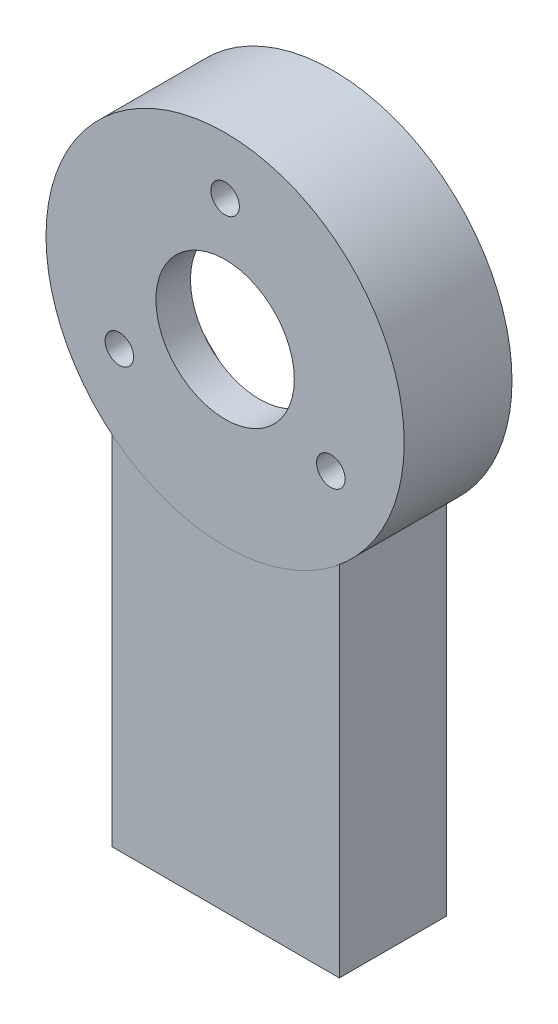
ISO-10303-21;
HEADER;
FILE_DESCRIPTION(('STEP AP214'),'2;1');
FILE_NAME('part.step','',(''),(''),'','','');
FILE_SCHEMA(('AUTOMOTIVE_DESIGN { 1 0 10303 214 1 1 1 1 }'));
ENDSEC;
DATA;
#1=APPLICATION_CONTEXT('core data for automotive mechanical design processes');
#2=APPLICATION_PROTOCOL_DEFINITION('international standard','automotive_design',2000,#1);
#3=PRODUCT_CONTEXT('',#1,'mechanical');
#4=PRODUCT('Part','Part','',(#3));
#5=PRODUCT_RELATED_PRODUCT_CATEGORY('part','',(#4));
#6=PRODUCT_DEFINITION_FORMATION('','',#4);
#7=PRODUCT_DEFINITION_CONTEXT('part definition',#1,'design');
#8=PRODUCT_DEFINITION('design','',#6,#7);
#9=PRODUCT_DEFINITION_SHAPE('','',#8);
#10=(LENGTH_UNIT() NAMED_UNIT(*) SI_UNIT(.MILLI.,.METRE.));
#11=(NAMED_UNIT(*) PLANE_ANGLE_UNIT() SI_UNIT($,.RADIAN.));
#12=(NAMED_UNIT(*) SI_UNIT($,.STERADIAN.) SOLID_ANGLE_UNIT());
#13=UNCERTAINTY_MEASURE_WITH_UNIT(LENGTH_MEASURE(1.E-05),#10,'distance_accuracy_value','');
#14=(GEOMETRIC_REPRESENTATION_CONTEXT(3) GLOBAL_UNCERTAINTY_ASSIGNED_CONTEXT((#13)) GLOBAL_UNIT_ASSIGNED_CONTEXT((#10,
#11,#12)) REPRESENTATION_CONTEXT('',''));
#15=CARTESIAN_POINT('',(0.,0.,0.));
#16=DIRECTION('',(0.,0.,1.));
#17=DIRECTION('',(1.,0.,0.));
#18=AXIS2_PLACEMENT_3D('',#15,#16,#17);
#19=CARTESIAN_POINT('',(0.,15.,-3.24236973091773));
#20=DIRECTION('',(0.,0.,1.));
#21=DIRECTION('',(1.,0.,0.));
#22=AXIS2_PLACEMENT_3D('',#19,#20,#21);
#23=CYLINDRICAL_SURFACE('',#22,1.75);
#24=CARTESIAN_POINT('',(0.,15.,10.));
#25=DIRECTION('',(0.,0.,1.));
#26=DIRECTION('',(1.,0.,0.));
#27=AXIS2_PLACEMENT_3D('',#24,#25,#26);
#28=CIRCLE('',#27,1.75);
#29=CARTESIAN_POINT('',(1.75,15.,10.));
#30=VERTEX_POINT('',#29);
#31=EDGE_CURVE('E118',#30,#30,#28,.T.);
#32=ORIENTED_EDGE('',*,*,#31,.T.);
#33=EDGE_LOOP('',(#32));
#34=FACE_BOUND('',#33,.T.);
#35=CARTESIAN_POINT('',(0.,15.,5.75763026908227));
#36=DIRECTION('',(0.,0.,-1.));
#37=DIRECTION('',(-1.,0.,0.));
#38=AXIS2_PLACEMENT_3D('',#35,#36,#37);
#39=CIRCLE('',#38,1.75);
#40=CARTESIAN_POINT('',(-1.75,15.,5.75763026908227));
#41=VERTEX_POINT('',#40);
#42=EDGE_CURVE('E99',#41,#41,#39,.F.);
#43=ORIENTED_EDGE('',*,*,#42,.F.);
#44=EDGE_LOOP('',(#43));
#45=FACE_BOUND('',#44,.T.);
#46=ADVANCED_FACE('F33',(#34,#45),#23,.F.);
#47=CARTESIAN_POINT('',(0.,0.,-3.24236973091773));
#48=DIRECTION('',(0.,0.,1.));
#49=DIRECTION('',(1.,0.,0.));
#50=AXIS2_PLACEMENT_3D('',#47,#48,#49);
#51=CYLINDRICAL_SURFACE('',#50,8.5);
#52=CARTESIAN_POINT('',(0.,0.,10.));
#53=DIRECTION('',(0.,0.,1.));
#54=DIRECTION('',(1.,0.,0.));
#55=AXIS2_PLACEMENT_3D('',#52,#53,#54);
#56=CIRCLE('',#55,8.5);
#57=CARTESIAN_POINT('',(8.5,0.,10.));
#58=VERTEX_POINT('',#57);
#59=EDGE_CURVE('E115',#58,#58,#56,.T.);
#60=ORIENTED_EDGE('',*,*,#59,.T.);
#61=EDGE_LOOP('',(#60));
#62=FACE_BOUND('',#61,.T.);
#63=CARTESIAN_POINT('',(0.,0.,5.75763026908227));
#64=DIRECTION('',(0.,0.,-1.));
#65=DIRECTION('',(-1.,0.,0.));
#66=AXIS2_PLACEMENT_3D('',#63,#64,#65);
#67=CIRCLE('',#66,8.5);
#68=CARTESIAN_POINT('',(-8.5,0.,5.75763026908227));
#69=VERTEX_POINT('',#68);
#70=EDGE_CURVE('E190',#69,#69,#67,.F.);
#71=ORIENTED_EDGE('',*,*,#70,.F.);
#72=EDGE_LOOP('',(#71));
#73=FACE_BOUND('',#72,.T.);
#74=ADVANCED_FACE('F143',(#62,#73),#51,.F.);
#75=CARTESIAN_POINT('',(12.9903810567672,-7.49999999999963,-3.24236973091773));
#76=DIRECTION('',(0.,0.,1.));
#77=DIRECTION('',(1.,0.,0.));
#78=AXIS2_PLACEMENT_3D('',#75,#76,#77);
#79=CYLINDRICAL_SURFACE('',#78,1.75000000000057);
#80=CARTESIAN_POINT('',(12.9903810567672,-7.49999999999963,10.));
#81=DIRECTION('',(0.,0.,1.));
#82=DIRECTION('',(1.,0.,0.));
#83=AXIS2_PLACEMENT_3D('',#80,#81,#82);
#84=CIRCLE('',#83,1.75000000000057);
#85=CARTESIAN_POINT('',(14.7403810567678,-7.49999999999963,10.));
#86=VERTEX_POINT('',#85);
#87=EDGE_CURVE('E112',#86,#86,#84,.T.);
#88=ORIENTED_EDGE('',*,*,#87,.T.);
#89=EDGE_LOOP('',(#88));
#90=FACE_BOUND('',#89,.T.);
#91=CARTESIAN_POINT('',(12.9903810567672,-7.49999999999963,5.75763026908227));
#92=DIRECTION('',(0.,0.,-1.));
#93=DIRECTION('',(-1.,0.,0.));
#94=AXIS2_PLACEMENT_3D('',#91,#92,#93);
#95=CIRCLE('',#94,1.75000000000057);
#96=CARTESIAN_POINT('',(11.2403810567666,-7.49999999999963,5.75763026908227));
#97=VERTEX_POINT('',#96);
#98=EDGE_CURVE('E186',#97,#97,#95,.F.);
#99=ORIENTED_EDGE('',*,*,#98,.F.);
#100=EDGE_LOOP('',(#99));
#101=FACE_BOUND('',#100,.T.);
#102=ADVANCED_FACE('F148',(#90,#101),#79,.F.);
#103=CARTESIAN_POINT('',(-12.9903810567659,-7.50000000000037,-3.24236973091773));
#104=DIRECTION('',(0.,0.,1.));
#105=DIRECTION('',(1.,0.,0.));
#106=AXIS2_PLACEMENT_3D('',#103,#104,#105);
#107=CYLINDRICAL_SURFACE('',#106,1.75000000000085);
#108=CARTESIAN_POINT('',(-12.9903810567659,-7.50000000000037,10.));
#109=DIRECTION('',(0.,0.,1.));
#110=DIRECTION('',(1.,0.,0.));
#111=AXIS2_PLACEMENT_3D('',#108,#109,#110);
#112=CIRCLE('',#111,1.75000000000085);
#113=CARTESIAN_POINT('',(-11.2403810567651,-7.50000000000037,10.));
#114=VERTEX_POINT('',#113);
#115=EDGE_CURVE('E107',#114,#114,#112,.T.);
#116=ORIENTED_EDGE('',*,*,#115,.T.);
#117=EDGE_LOOP('',(#116));
#118=FACE_BOUND('',#117,.T.);
#119=CARTESIAN_POINT('',(-12.9903810567659,-7.50000000000037,5.75763026908227));
#120=DIRECTION('',(0.,0.,-1.));
#121=DIRECTION('',(-1.,0.,0.));
#122=AXIS2_PLACEMENT_3D('',#119,#120,#121);
#123=CIRCLE('',#122,1.75000000000085);
#124=CARTESIAN_POINT('',(-14.7403810567668,-7.50000000000037,5.75763026908227));
#125=VERTEX_POINT('',#124);
#126=EDGE_CURVE('E37',#125,#125,#123,.F.);
#127=ORIENTED_EDGE('',*,*,#126,.F.);
#128=EDGE_LOOP('',(#127));
#129=FACE_BOUND('',#128,.T.);
#130=ADVANCED_FACE('F139',(#118,#129),#107,.F.);
#131=CARTESIAN_POINT('',(0.,0.,-3.24236973091773));
#132=DIRECTION('',(0.,0.,1.));
#133=DIRECTION('',(1.,0.,0.));
#134=AXIS2_PLACEMENT_3D('',#131,#132,#133);
#135=CYLINDRICAL_SURFACE('',#134,22.);
#136=DIRECTION('',(0.,0.,-1.));
#137=VECTOR('',#136,1.);
#138=CARTESIAN_POINT('',(13.9535665739957,-17.0087618557339,9.91810473822878));
#139=LINE('',#138,#137);
#140=CARTESIAN_POINT('',(13.9535665739957,-17.0087618557339,9.91810473822878));
#141=VERTEX_POINT('',#140);
#142=CARTESIAN_POINT('',(13.9535665739957,-17.0087618557339,-3.24236973091773));
#143=VERTEX_POINT('',#142);
#144=EDGE_CURVE('E93',#141,#143,#139,.T.);
#145=ORIENTED_EDGE('',*,*,#144,.T.);
#146=CARTESIAN_POINT('',(0.,0.,-3.24236973091773));
#147=DIRECTION('',(0.,0.,1.));
#148=DIRECTION('',(1.,0.,0.));
#149=AXIS2_PLACEMENT_3D('',#146,#147,#148);
#150=CIRCLE('',#149,22.);
#151=CARTESIAN_POINT('',(-13.9535665739957,-17.0087618557339,-3.24236973091773));
#152=VERTEX_POINT('',#151);
#153=EDGE_CURVE('E42',#143,#152,#150,.T.);
#154=ORIENTED_EDGE('',*,*,#153,.T.);
#155=DIRECTION('',(0.,0.,-1.));
#156=VECTOR('',#155,1.);
#157=CARTESIAN_POINT('',(-13.9535665739957,-17.0087618557339,9.91810473822878));
#158=LINE('',#157,#156);
#159=CARTESIAN_POINT('',(-13.9535665739957,-17.0087618557339,9.91810473822878));
#160=VERTEX_POINT('',#159);
#161=EDGE_CURVE('E52',#160,#152,#158,.T.);
#162=ORIENTED_EDGE('',*,*,#161,.F.);
#163=CARTESIAN_POINT('',(0.,0.,9.91810473822878));
#164=DIRECTION('',(0.,0.,-1.));
#165=DIRECTION('',(-1.,0.,0.));
#166=AXIS2_PLACEMENT_3D('',#163,#164,#165);
#167=CIRCLE('',#166,22.);
#168=EDGE_CURVE('E11',#160,#141,#167,.F.);
#169=ORIENTED_EDGE('',*,*,#168,.T.);
#170=EDGE_LOOP('',(#145,#154,#162,#169));
#171=FACE_BOUND('',#170,.T.);
#172=CARTESIAN_POINT('',(0.,0.,10.));
#173=DIRECTION('',(0.,0.,1.));
#174=DIRECTION('',(1.,0.,0.));
#175=AXIS2_PLACEMENT_3D('',#172,#173,#174);
#176=CIRCLE('',#175,22.);
#177=CARTESIAN_POINT('',(22.,0.,10.));
#178=VERTEX_POINT('',#177);
#179=EDGE_CURVE('E121',#178,#178,#176,.T.);
#180=ORIENTED_EDGE('',*,*,#179,.F.);
#181=EDGE_LOOP('',(#180));
#182=FACE_BOUND('',#181,.T.);
#183=ADVANCED_FACE('F35',(#171,#182),#135,.T.);
#184=CARTESIAN_POINT('',(0.,0.,-3.24236973091773));
#185=DIRECTION('',(0.,0.,1.));
#186=DIRECTION('',(1.,0.,0.));
#187=AXIS2_PLACEMENT_3D('',#184,#185,#186);
#188=PLANE('',#187);
#189=CARTESIAN_POINT('',(0.,0.,-3.24236973091773));
#190=DIRECTION('',(0.,0.,-1.));
#191=DIRECTION('',(-1.,0.,0.));
#192=AXIS2_PLACEMENT_3D('',#189,#190,#191);
#193=CIRCLE('',#192,21.15);
#194=CARTESIAN_POINT('',(-21.15,0.,-3.24236973091773));
#195=VERTEX_POINT('',#194);
#196=EDGE_CURVE('E195',#195,#195,#193,.T.);
#197=ORIENTED_EDGE('',*,*,#196,.F.);
#198=EDGE_LOOP('',(#197));
#199=FACE_BOUND('',#198,.T.);
#200=ORIENTED_EDGE('',*,*,#153,.F.);
#201=DIRECTION('',(0.,-1.,0.));
#202=VECTOR('',#201,1.);
#203=CARTESIAN_POINT('',(13.9535665739957,-17.0087618557339,-3.24236973091773));
#204=LINE('',#203,#202);
#205=CARTESIAN_POINT('',(13.9535665739957,-61.,-3.24236973091773));
#206=VERTEX_POINT('',#205);
#207=EDGE_CURVE('E103',#143,#206,#204,.T.);
#208=ORIENTED_EDGE('',*,*,#207,.T.);
#209=DIRECTION('',(-1.,0.,0.));
#210=VECTOR('',#209,1.);
#211=CARTESIAN_POINT('',(13.9535665739957,-61.,-3.24236973091773));
#212=LINE('',#211,#210);
#213=CARTESIAN_POINT('',(-13.9535665739957,-61.,-3.24236973091773));
#214=VERTEX_POINT('',#213);
#215=EDGE_CURVE('E77',#206,#214,#212,.T.);
#216=ORIENTED_EDGE('',*,*,#215,.T.);
#217=DIRECTION('',(0.,1.,0.));
#218=VECTOR('',#217,1.);
#219=CARTESIAN_POINT('',(-13.9535665739957,-17.0087618557339,-3.24236973091773));
#220=LINE('',#219,#218);
#221=EDGE_CURVE('E94',#214,#152,#220,.T.);
#222=ORIENTED_EDGE('',*,*,#221,.T.);
#223=EDGE_LOOP('',(#200,#208,#216,#222));
#224=FACE_BOUND('',#223,.T.);
#225=ADVANCED_FACE('F129',(#199,#224),#188,.F.);
#226=CARTESIAN_POINT('',(0.,0.,10.));
#227=DIRECTION('',(0.,0.,1.));
#228=DIRECTION('',(1.,0.,0.));
#229=AXIS2_PLACEMENT_3D('',#226,#227,#228);
#230=PLANE('',#229);
#231=ORIENTED_EDGE('',*,*,#87,.F.);
#232=EDGE_LOOP('',(#231));
#233=FACE_BOUND('',#232,.T.);
#234=ORIENTED_EDGE('',*,*,#31,.F.);
#235=EDGE_LOOP('',(#234));
#236=FACE_BOUND('',#235,.T.);
#237=ORIENTED_EDGE('',*,*,#179,.T.);
#238=EDGE_LOOP('',(#237));
#239=FACE_BOUND('',#238,.T.);
#240=ORIENTED_EDGE('',*,*,#59,.F.);
#241=EDGE_LOOP('',(#240));
#242=FACE_BOUND('',#241,.T.);
#243=ORIENTED_EDGE('',*,*,#115,.F.);
#244=EDGE_LOOP('',(#243));
#245=FACE_BOUND('',#244,.T.);
#246=ADVANCED_FACE('F131',(#233,#236,#239,#242,#245),#230,.T.);
#247=CARTESIAN_POINT('',(13.9535665739957,-17.0087618557339,9.91810473822878));
#248=DIRECTION('',(1.,0.,0.));
#249=DIRECTION('',(0.,1.,0.));
#250=AXIS2_PLACEMENT_3D('',#247,#248,#249);
#251=PLANE('',#250);
#252=ORIENTED_EDGE('',*,*,#207,.F.);
#253=ORIENTED_EDGE('',*,*,#144,.F.);
#254=DIRECTION('',(0.,-1.,0.));
#255=VECTOR('',#254,1.);
#256=CARTESIAN_POINT('',(13.9535665739957,-17.0087618557339,9.91810473822878));
#257=LINE('',#256,#255);
#258=CARTESIAN_POINT('',(13.9535665739957,-61.,9.91810473822878));
#259=VERTEX_POINT('',#258);
#260=EDGE_CURVE('E89',#141,#259,#257,.T.);
#261=ORIENTED_EDGE('',*,*,#260,.T.);
#262=DIRECTION('',(0.,0.,-1.));
#263=VECTOR('',#262,1.);
#264=CARTESIAN_POINT('',(13.9535665739957,-61.,9.91810473822878));
#265=LINE('',#264,#263);
#266=EDGE_CURVE('E72',#259,#206,#265,.T.);
#267=ORIENTED_EDGE('',*,*,#266,.T.);
#268=EDGE_LOOP('',(#252,#253,#261,#267));
#269=FACE_BOUND('',#268,.T.);
#270=ADVANCED_FACE('F92',(#269),#251,.T.);
#271=CARTESIAN_POINT('',(-13.9535665739957,-17.0087618557339,9.91810473822878));
#272=DIRECTION('',(-1.,0.,0.));
#273=DIRECTION('',(0.,-1.,0.));
#274=AXIS2_PLACEMENT_3D('',#271,#272,#273);
#275=PLANE('',#274);
#276=ORIENTED_EDGE('',*,*,#221,.F.);
#277=DIRECTION('',(0.,0.,-1.));
#278=VECTOR('',#277,1.);
#279=CARTESIAN_POINT('',(-13.9535665739957,-61.,9.91810473822878));
#280=LINE('',#279,#278);
#281=CARTESIAN_POINT('',(-13.9535665739957,-61.,9.91810473822878));
#282=VERTEX_POINT('',#281);
#283=EDGE_CURVE('E82',#282,#214,#280,.T.);
#284=ORIENTED_EDGE('',*,*,#283,.F.);
#285=DIRECTION('',(0.,1.,0.));
#286=VECTOR('',#285,1.);
#287=CARTESIAN_POINT('',(-13.9535665739957,-17.0087618557339,9.91810473822878));
#288=LINE('',#287,#286);
#289=EDGE_CURVE('E83',#282,#160,#288,.T.);
#290=ORIENTED_EDGE('',*,*,#289,.T.);
#291=ORIENTED_EDGE('',*,*,#161,.T.);
#292=EDGE_LOOP('',(#276,#284,#290,#291));
#293=FACE_BOUND('',#292,.T.);
#294=ADVANCED_FACE('F128',(#293),#275,.T.);
#295=CARTESIAN_POINT('',(13.9535665739957,-61.,9.91810473822878));
#296=DIRECTION('',(0.,-1.,0.));
#297=DIRECTION('',(0.,0.,-1.));
#298=AXIS2_PLACEMENT_3D('',#295,#296,#297);
#299=PLANE('',#298);
#300=ORIENTED_EDGE('',*,*,#215,.F.);
#301=ORIENTED_EDGE('',*,*,#266,.F.);
#302=DIRECTION('',(-1.,0.,0.));
#303=VECTOR('',#302,1.);
#304=CARTESIAN_POINT('',(13.9535665739957,-61.,9.91810473822878));
#305=LINE('',#304,#303);
#306=EDGE_CURVE('E75',#259,#282,#305,.T.);
#307=ORIENTED_EDGE('',*,*,#306,.T.);
#308=ORIENTED_EDGE('',*,*,#283,.T.);
#309=EDGE_LOOP('',(#300,#301,#307,#308));
#310=FACE_BOUND('',#309,.T.);
#311=ADVANCED_FACE('F74',(#310),#299,.T.);
#312=CARTESIAN_POINT('',(0.,0.,9.91810473822878));
#313=DIRECTION('',(0.,0.,-1.));
#314=DIRECTION('',(-1.,0.,0.));
#315=AXIS2_PLACEMENT_3D('',#312,#313,#314);
#316=PLANE('',#315);
#317=ORIENTED_EDGE('',*,*,#168,.F.);
#318=ORIENTED_EDGE('',*,*,#289,.F.);
#319=ORIENTED_EDGE('',*,*,#306,.F.);
#320=ORIENTED_EDGE('',*,*,#260,.F.);
#321=EDGE_LOOP('',(#317,#318,#319,#320));
#322=FACE_BOUND('',#321,.T.);
#323=ADVANCED_FACE('F88',(#322),#316,.F.);
#324=CARTESIAN_POINT('',(0.,0.,5.75763026908227));
#325=DIRECTION('',(0.,0.,-1.));
#326=DIRECTION('',(-1.,0.,0.));
#327=AXIS2_PLACEMENT_3D('',#324,#325,#326);
#328=PLANE('',#327);
#329=CARTESIAN_POINT('',(0.,0.,5.75763026908227));
#330=DIRECTION('',(0.,0.,-1.));
#331=DIRECTION('',(-1.,0.,0.));
#332=AXIS2_PLACEMENT_3D('',#329,#330,#331);
#333=CIRCLE('',#332,21.15);
#334=CARTESIAN_POINT('',(-21.15,0.,5.75763026908227));
#335=VERTEX_POINT('',#334);
#336=EDGE_CURVE('E179',#335,#335,#333,.T.);
#337=ORIENTED_EDGE('',*,*,#336,.T.);
#338=EDGE_LOOP('',(#337));
#339=FACE_BOUND('',#338,.T.);
#340=ORIENTED_EDGE('',*,*,#126,.T.);
#341=EDGE_LOOP('',(#340));
#342=FACE_BOUND('',#341,.T.);
#343=ORIENTED_EDGE('',*,*,#98,.T.);
#344=EDGE_LOOP('',(#343));
#345=FACE_BOUND('',#344,.T.);
#346=ORIENTED_EDGE('',*,*,#70,.T.);
#347=EDGE_LOOP('',(#346));
#348=FACE_BOUND('',#347,.T.);
#349=ORIENTED_EDGE('',*,*,#42,.T.);
#350=EDGE_LOOP('',(#349));
#351=FACE_BOUND('',#350,.T.);
#352=ADVANCED_FACE('F167',(#339,#342,#345,#348,#351),#328,.T.);
#353=CARTESIAN_POINT('',(0.,0.,5.75763026908227));
#354=DIRECTION('',(0.,0.,-1.));
#355=DIRECTION('',(-1.,0.,0.));
#356=AXIS2_PLACEMENT_3D('',#353,#354,#355);
#357=CYLINDRICAL_SURFACE('',#356,21.15);
#358=ORIENTED_EDGE('',*,*,#336,.F.);
#359=EDGE_LOOP('',(#358));
#360=FACE_BOUND('',#359,.T.);
#361=ORIENTED_EDGE('',*,*,#196,.T.);
#362=EDGE_LOOP('',(#361));
#363=FACE_BOUND('',#362,.T.);
#364=ADVANCED_FACE('F168',(#360,#363),#357,.F.);
#365=CLOSED_SHELL('',(#46,#74,#102,#130,#183,#225,#246,#270,#294,#311,#323,#352,#364));
#366=MANIFOLD_SOLID_BREP('B2',#365);
#367=ADVANCED_BREP_SHAPE_REPRESENTATION('',(#18,#366),#14);
#368=SHAPE_DEFINITION_REPRESENTATION(#9,#367);
ENDSEC;
END-ISO-10303-21;
